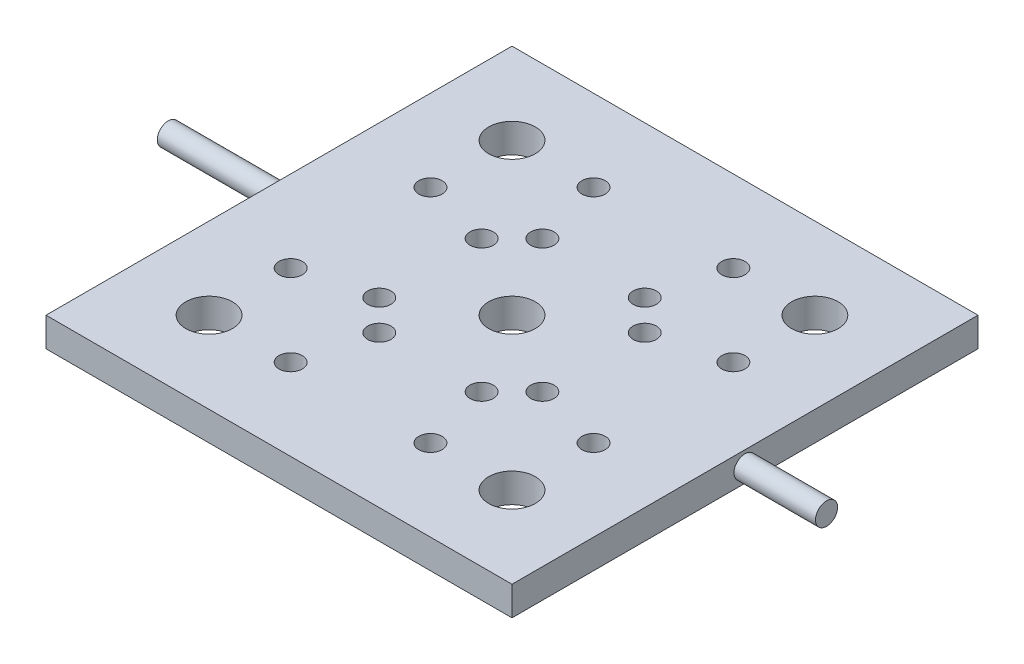
ISO-10303-21;
HEADER;
FILE_DESCRIPTION(('STEP AP214'),'2;1');
FILE_NAME('part.step','',(''),(''),'','','');
FILE_SCHEMA(('AUTOMOTIVE_DESIGN { 1 0 10303 214 1 1 1 1 }'));
ENDSEC;
DATA;
#1=APPLICATION_CONTEXT('core data for automotive mechanical design processes');
#2=APPLICATION_PROTOCOL_DEFINITION('international standard','automotive_design',2000,#1);
#3=PRODUCT_CONTEXT('',#1,'mechanical');
#4=PRODUCT('Part','Part','',(#3));
#5=PRODUCT_RELATED_PRODUCT_CATEGORY('part','',(#4));
#6=PRODUCT_DEFINITION_FORMATION('','',#4);
#7=PRODUCT_DEFINITION_CONTEXT('part definition',#1,'design');
#8=PRODUCT_DEFINITION('design','',#6,#7);
#9=PRODUCT_DEFINITION_SHAPE('','',#8);
#10=(LENGTH_UNIT() NAMED_UNIT(*) SI_UNIT(.MILLI.,.METRE.));
#11=(NAMED_UNIT(*) PLANE_ANGLE_UNIT() SI_UNIT($,.RADIAN.));
#12=(NAMED_UNIT(*) SI_UNIT($,.STERADIAN.) SOLID_ANGLE_UNIT());
#13=UNCERTAINTY_MEASURE_WITH_UNIT(LENGTH_MEASURE(1.E-05),#10,'distance_accuracy_value','');
#14=(GEOMETRIC_REPRESENTATION_CONTEXT(3) GLOBAL_UNCERTAINTY_ASSIGNED_CONTEXT((#13)) GLOBAL_UNIT_ASSIGNED_CONTEXT((#10,
#11,#12)) REPRESENTATION_CONTEXT('',''));
#15=CARTESIAN_POINT('',(0.,0.,0.));
#16=DIRECTION('',(0.,0.,1.));
#17=DIRECTION('',(1.,0.,0.));
#18=AXIS2_PLACEMENT_3D('',#15,#16,#17);
#19=CARTESIAN_POINT('',(25.4,1.5875,25.4));
#20=DIRECTION('',(-1.,0.,0.));
#21=DIRECTION('',(0.,0.,1.));
#22=AXIS2_PLACEMENT_3D('',#19,#20,#21);
#23=PLANE('',#22);
#24=CARTESIAN_POINT('',(25.4,0.,0.));
#25=DIRECTION('',(-1.,0.,0.));
#26=DIRECTION('',(0.,0.,1.));
#27=AXIS2_PLACEMENT_3D('',#24,#25,#26);
#28=CIRCLE('',#27,1.2065);
#29=CARTESIAN_POINT('',(25.4,0.,1.2065));
#30=VERTEX_POINT('',#29);
#31=EDGE_CURVE('E57',#30,#30,#28,.F.);
#32=ORIENTED_EDGE('',*,*,#31,.F.);
#33=EDGE_LOOP('',(#32));
#34=FACE_BOUND('',#33,.T.);
#35=DIRECTION('',(0.,0.,-1.));
#36=VECTOR('',#35,1.);
#37=CARTESIAN_POINT('',(25.4,-1.5875,25.4));
#38=LINE('',#37,#36);
#39=CARTESIAN_POINT('',(25.4,-1.5875,25.4));
#40=VERTEX_POINT('',#39);
#41=CARTESIAN_POINT('',(25.4,-1.5875,-25.4));
#42=VERTEX_POINT('',#41);
#43=EDGE_CURVE('E116',#40,#42,#38,.T.);
#44=ORIENTED_EDGE('',*,*,#43,.T.);
#45=DIRECTION('',(0.,-1.,0.));
#46=VECTOR('',#45,1.);
#47=CARTESIAN_POINT('',(25.4,1.5875,-25.4));
#48=LINE('',#47,#46);
#49=CARTESIAN_POINT('',(25.4,1.5875,-25.4));
#50=VERTEX_POINT('',#49);
#51=EDGE_CURVE('E107',#50,#42,#48,.T.);
#52=ORIENTED_EDGE('',*,*,#51,.F.);
#53=DIRECTION('',(0.,0.,-1.));
#54=VECTOR('',#53,1.);
#55=CARTESIAN_POINT('',(25.4,1.5875,25.4));
#56=LINE('',#55,#54);
#57=CARTESIAN_POINT('',(25.4,1.5875,25.4));
#58=VERTEX_POINT('',#57);
#59=EDGE_CURVE('E101',#58,#50,#56,.T.);
#60=ORIENTED_EDGE('',*,*,#59,.F.);
#61=DIRECTION('',(0.,-1.,0.));
#62=VECTOR('',#61,1.);
#63=CARTESIAN_POINT('',(25.4,1.5875,25.4));
#64=LINE('',#63,#62);
#65=EDGE_CURVE('E112',#58,#40,#64,.T.);
#66=ORIENTED_EDGE('',*,*,#65,.T.);
#67=EDGE_LOOP('',(#44,#52,#60,#66));
#68=FACE_BOUND('',#67,.T.);
#69=ADVANCED_FACE('F49',(#34,#68),#23,.F.);
#70=CARTESIAN_POINT('',(-25.4,1.5875,-25.4));
#71=DIRECTION('',(0.,0.,1.));
#72=DIRECTION('',(1.,0.,0.));
#73=AXIS2_PLACEMENT_3D('',#70,#71,#72);
#74=PLANE('',#73);
#75=DIRECTION('',(-1.,0.,0.));
#76=VECTOR('',#75,1.);
#77=CARTESIAN_POINT('',(-25.4,-1.5875,-25.4));
#78=LINE('',#77,#76);
#79=CARTESIAN_POINT('',(-25.4,-1.5875,-25.4));
#80=VERTEX_POINT('',#79);
#81=EDGE_CURVE('E106',#42,#80,#78,.T.);
#82=ORIENTED_EDGE('',*,*,#81,.T.);
#83=DIRECTION('',(0.,-1.,0.));
#84=VECTOR('',#83,1.);
#85=CARTESIAN_POINT('',(-25.4,1.5875,-25.4));
#86=LINE('',#85,#84);
#87=CARTESIAN_POINT('',(-25.4,1.5875,-25.4));
#88=VERTEX_POINT('',#87);
#89=EDGE_CURVE('E104',#88,#80,#86,.T.);
#90=ORIENTED_EDGE('',*,*,#89,.F.);
#91=DIRECTION('',(-1.,0.,0.));
#92=VECTOR('',#91,1.);
#93=CARTESIAN_POINT('',(-25.4,1.5875,-25.4));
#94=LINE('',#93,#92);
#95=EDGE_CURVE('E96',#50,#88,#94,.T.);
#96=ORIENTED_EDGE('',*,*,#95,.F.);
#97=ORIENTED_EDGE('',*,*,#51,.T.);
#98=EDGE_LOOP('',(#82,#90,#96,#97));
#99=FACE_BOUND('',#98,.T.);
#100=ADVANCED_FACE('F105',(#99),#74,.F.);
#101=CARTESIAN_POINT('',(-25.4,1.5875,25.4));
#102=DIRECTION('',(1.,0.,0.));
#103=DIRECTION('',(0.,0.,-1.));
#104=AXIS2_PLACEMENT_3D('',#101,#102,#103);
#105=PLANE('',#104);
#106=CARTESIAN_POINT('',(-25.4,0.,0.));
#107=DIRECTION('',(1.,0.,0.));
#108=DIRECTION('',(0.,0.,-1.));
#109=AXIS2_PLACEMENT_3D('',#106,#107,#108);
#110=CIRCLE('',#109,1.2065);
#111=CARTESIAN_POINT('',(-25.4,0.,-1.2065));
#112=VERTEX_POINT('',#111);
#113=EDGE_CURVE('E13',#112,#112,#110,.F.);
#114=ORIENTED_EDGE('',*,*,#113,.F.);
#115=EDGE_LOOP('',(#114));
#116=FACE_BOUND('',#115,.T.);
#117=DIRECTION('',(0.,0.,1.));
#118=VECTOR('',#117,1.);
#119=CARTESIAN_POINT('',(-25.4,-1.5875,25.4));
#120=LINE('',#119,#118);
#121=CARTESIAN_POINT('',(-25.4,-1.5875,25.4));
#122=VERTEX_POINT('',#121);
#123=EDGE_CURVE('E82',#80,#122,#120,.T.);
#124=ORIENTED_EDGE('',*,*,#123,.T.);
#125=DIRECTION('',(0.,-1.,0.));
#126=VECTOR('',#125,1.);
#127=CARTESIAN_POINT('',(-25.4,1.5875,25.4));
#128=LINE('',#127,#126);
#129=CARTESIAN_POINT('',(-25.4,1.5875,25.4));
#130=VERTEX_POINT('',#129);
#131=EDGE_CURVE('E108',#130,#122,#128,.T.);
#132=ORIENTED_EDGE('',*,*,#131,.F.);
#133=DIRECTION('',(0.,0.,1.));
#134=VECTOR('',#133,1.);
#135=CARTESIAN_POINT('',(-25.4,1.5875,25.4));
#136=LINE('',#135,#134);
#137=EDGE_CURVE('E99',#88,#130,#136,.T.);
#138=ORIENTED_EDGE('',*,*,#137,.F.);
#139=ORIENTED_EDGE('',*,*,#89,.T.);
#140=EDGE_LOOP('',(#124,#132,#138,#139));
#141=FACE_BOUND('',#140,.T.);
#142=ADVANCED_FACE('F110',(#116,#141),#105,.F.);
#143=CARTESIAN_POINT('',(-25.4,1.5875,25.4));
#144=DIRECTION('',(0.,0.,-1.));
#145=DIRECTION('',(-1.,0.,0.));
#146=AXIS2_PLACEMENT_3D('',#143,#144,#145);
#147=PLANE('',#146);
#148=DIRECTION('',(1.,0.,0.));
#149=VECTOR('',#148,1.);
#150=CARTESIAN_POINT('',(-25.4,-1.5875,25.4));
#151=LINE('',#150,#149);
#152=EDGE_CURVE('E88',#122,#40,#151,.T.);
#153=ORIENTED_EDGE('',*,*,#152,.T.);
#154=ORIENTED_EDGE('',*,*,#65,.F.);
#155=DIRECTION('',(1.,0.,0.));
#156=VECTOR('',#155,1.);
#157=CARTESIAN_POINT('',(-25.4,1.5875,25.4));
#158=LINE('',#157,#156);
#159=EDGE_CURVE('E65',#130,#58,#158,.T.);
#160=ORIENTED_EDGE('',*,*,#159,.F.);
#161=ORIENTED_EDGE('',*,*,#131,.T.);
#162=EDGE_LOOP('',(#153,#154,#160,#161));
#163=FACE_BOUND('',#162,.T.);
#164=ADVANCED_FACE('F145',(#163),#147,.F.);
#165=CARTESIAN_POINT('',(0.,1.5875,0.));
#166=DIRECTION('',(0.,-1.,0.));
#167=DIRECTION('',(0.,0.,-1.));
#168=AXIS2_PLACEMENT_3D('',#165,#166,#167);
#169=PLANE('',#168);
#170=CARTESIAN_POINT('',(-16.51,1.5875,7.62));
#171=DIRECTION('',(0.,1.,0.));
#172=DIRECTION('',(0.,0.,1.));
#173=AXIS2_PLACEMENT_3D('',#170,#171,#172);
#174=CIRCLE('',#173,1.27);
#175=CARTESIAN_POINT('',(-16.51,1.5875,8.89));
#176=VERTEX_POINT('',#175);
#177=EDGE_CURVE('E491',#176,#176,#174,.T.);
#178=ORIENTED_EDGE('',*,*,#177,.F.);
#179=EDGE_LOOP('',(#178));
#180=FACE_BOUND('',#179,.T.);
#181=CARTESIAN_POINT('',(16.51,1.5875,-7.62));
#182=DIRECTION('',(0.,1.,0.));
#183=DIRECTION('',(0.,0.,-1.));
#184=AXIS2_PLACEMENT_3D('',#181,#182,#183);
#185=CIRCLE('',#184,1.27);
#186=CARTESIAN_POINT('',(16.51,1.5875,-8.89));
#187=VERTEX_POINT('',#186);
#188=EDGE_CURVE('E497',#187,#187,#185,.T.);
#189=ORIENTED_EDGE('',*,*,#188,.F.);
#190=EDGE_LOOP('',(#189));
#191=FACE_BOUND('',#190,.T.);
#192=CARTESIAN_POINT('',(16.51,1.5875,7.62));
#193=DIRECTION('',(0.,1.,0.));
#194=DIRECTION('',(0.,0.,-1.));
#195=AXIS2_PLACEMENT_3D('',#192,#193,#194);
#196=CIRCLE('',#195,1.27);
#197=CARTESIAN_POINT('',(16.51,1.5875,6.35));
#198=VERTEX_POINT('',#197);
#199=EDGE_CURVE('E479',#198,#198,#196,.T.);
#200=ORIENTED_EDGE('',*,*,#199,.F.);
#201=EDGE_LOOP('',(#200));
#202=FACE_BOUND('',#201,.T.);
#203=CARTESIAN_POINT('',(-7.62000000000003,1.5875,16.51));
#204=DIRECTION('',(0.,1.,0.));
#205=DIRECTION('',(0.,0.,-1.));
#206=AXIS2_PLACEMENT_3D('',#203,#204,#205);
#207=CIRCLE('',#206,1.27);
#208=CARTESIAN_POINT('',(-7.62000000000003,1.5875,15.24));
#209=VERTEX_POINT('',#208);
#210=EDGE_CURVE('E486',#209,#209,#207,.T.);
#211=ORIENTED_EDGE('',*,*,#210,.F.);
#212=EDGE_LOOP('',(#211));
#213=FACE_BOUND('',#212,.T.);
#214=CARTESIAN_POINT('',(5.57822715367485,1.5875,-8.89000000000003));
#215=DIRECTION('',(0.,1.,0.));
#216=DIRECTION('',(0.,0.,1.));
#217=AXIS2_PLACEMENT_3D('',#214,#215,#216);
#218=CIRCLE('',#217,1.27000000000001);
#219=CARTESIAN_POINT('',(5.57822715367485,1.5875,-7.62000000000002));
#220=VERTEX_POINT('',#219);
#221=EDGE_CURVE('E521',#220,#220,#218,.T.);
#222=ORIENTED_EDGE('',*,*,#221,.F.);
#223=EDGE_LOOP('',(#222));
#224=FACE_BOUND('',#223,.T.);
#225=CARTESIAN_POINT('',(-5.57822715367481,1.5875,-8.88999999999992));
#226=DIRECTION('',(0.,1.,0.));
#227=DIRECTION('',(0.,0.,1.));
#228=AXIS2_PLACEMENT_3D('',#225,#226,#227);
#229=CIRCLE('',#228,1.27);
#230=CARTESIAN_POINT('',(-5.57822715367481,1.5875,-7.61999999999992));
#231=VERTEX_POINT('',#230);
#232=EDGE_CURVE('E515',#231,#231,#229,.T.);
#233=ORIENTED_EDGE('',*,*,#232,.F.);
#234=EDGE_LOOP('',(#233));
#235=FACE_BOUND('',#234,.T.);
#236=CARTESIAN_POINT('',(8.89000000000029,1.5875,5.57822715367478));
#237=DIRECTION('',(0.,1.,0.));
#238=DIRECTION('',(0.,0.,1.));
#239=AXIS2_PLACEMENT_3D('',#236,#237,#238);
#240=CIRCLE('',#239,1.27000000000001);
#241=CARTESIAN_POINT('',(8.89000000000029,1.5875,6.84822715367479));
#242=VERTEX_POINT('',#241);
#243=EDGE_CURVE('E509',#242,#242,#240,.T.);
#244=ORIENTED_EDGE('',*,*,#243,.F.);
#245=EDGE_LOOP('',(#244));
#246=FACE_BOUND('',#245,.T.);
#247=CARTESIAN_POINT('',(8.89000000000018,1.5875,-5.57822715367489));
#248=DIRECTION('',(0.,1.,0.));
#249=DIRECTION('',(0.,0.,1.));
#250=AXIS2_PLACEMENT_3D('',#247,#248,#249);
#251=CIRCLE('',#250,1.27);
#252=CARTESIAN_POINT('',(8.89000000000018,1.5875,-4.30822715367489));
#253=VERTEX_POINT('',#252);
#254=EDGE_CURVE('E502',#253,#253,#251,.T.);
#255=ORIENTED_EDGE('',*,*,#254,.F.);
#256=EDGE_LOOP('',(#255));
#257=FACE_BOUND('',#256,.T.);
#258=CARTESIAN_POINT('',(-16.51,1.5875,-16.51));
#259=DIRECTION('',(0.,1.,0.));
#260=DIRECTION('',(0.,0.,1.));
#261=AXIS2_PLACEMENT_3D('',#258,#259,#260);
#262=CIRCLE('',#261,2.54);
#263=CARTESIAN_POINT('',(-16.51,1.5875,-13.97));
#264=VERTEX_POINT('',#263);
#265=EDGE_CURVE('E450',#264,#264,#262,.T.);
#266=ORIENTED_EDGE('',*,*,#265,.F.);
#267=EDGE_LOOP('',(#266));
#268=FACE_BOUND('',#267,.T.);
#269=CARTESIAN_POINT('',(16.51,1.5875,-16.51));
#270=DIRECTION('',(0.,1.,0.));
#271=DIRECTION('',(0.,0.,1.));
#272=AXIS2_PLACEMENT_3D('',#269,#270,#271);
#273=CIRCLE('',#272,2.54);
#274=CARTESIAN_POINT('',(16.51,1.5875,-13.97));
#275=VERTEX_POINT('',#274);
#276=EDGE_CURVE('E444',#275,#275,#273,.T.);
#277=ORIENTED_EDGE('',*,*,#276,.F.);
#278=EDGE_LOOP('',(#277));
#279=FACE_BOUND('',#278,.T.);
#280=CARTESIAN_POINT('',(16.51,1.5875,16.51));
#281=DIRECTION('',(0.,1.,0.));
#282=DIRECTION('',(0.,0.,1.));
#283=AXIS2_PLACEMENT_3D('',#280,#281,#282);
#284=CIRCLE('',#283,2.54);
#285=CARTESIAN_POINT('',(16.51,1.5875,19.05));
#286=VERTEX_POINT('',#285);
#287=EDGE_CURVE('E438',#286,#286,#284,.T.);
#288=ORIENTED_EDGE('',*,*,#287,.F.);
#289=EDGE_LOOP('',(#288));
#290=FACE_BOUND('',#289,.T.);
#291=CARTESIAN_POINT('',(-16.51,1.5875,16.51));
#292=DIRECTION('',(0.,1.,0.));
#293=DIRECTION('',(0.,0.,1.));
#294=AXIS2_PLACEMENT_3D('',#291,#292,#293);
#295=CIRCLE('',#294,2.54);
#296=CARTESIAN_POINT('',(-16.51,1.5875,19.05));
#297=VERTEX_POINT('',#296);
#298=EDGE_CURVE('E431',#297,#297,#295,.T.);
#299=ORIENTED_EDGE('',*,*,#298,.F.);
#300=EDGE_LOOP('',(#299));
#301=FACE_BOUND('',#300,.T.);
#302=CARTESIAN_POINT('',(-16.51,1.5875,-7.62));
#303=DIRECTION('',(0.,1.,0.));
#304=DIRECTION('',(0.,0.,1.));
#305=AXIS2_PLACEMENT_3D('',#302,#303,#304);
#306=CIRCLE('',#305,1.27);
#307=CARTESIAN_POINT('',(-16.51,1.5875,-6.35));
#308=VERTEX_POINT('',#307);
#309=EDGE_CURVE('E474',#308,#308,#306,.T.);
#310=ORIENTED_EDGE('',*,*,#309,.F.);
#311=EDGE_LOOP('',(#310));
#312=FACE_BOUND('',#311,.T.);
#313=CARTESIAN_POINT('',(-7.62000000000001,1.5875,-16.51));
#314=DIRECTION('',(0.,1.,0.));
#315=DIRECTION('',(0.,0.,1.));
#316=AXIS2_PLACEMENT_3D('',#313,#314,#315);
#317=CIRCLE('',#316,1.27);
#318=CARTESIAN_POINT('',(-7.62000000000001,1.5875,-15.24));
#319=VERTEX_POINT('',#318);
#320=EDGE_CURVE('E468',#319,#319,#317,.T.);
#321=ORIENTED_EDGE('',*,*,#320,.F.);
#322=EDGE_LOOP('',(#321));
#323=FACE_BOUND('',#322,.T.);
#324=CARTESIAN_POINT('',(7.61999999999999,1.5875,-16.51));
#325=DIRECTION('',(0.,1.,0.));
#326=DIRECTION('',(0.,0.,1.));
#327=AXIS2_PLACEMENT_3D('',#324,#325,#326);
#328=CIRCLE('',#327,1.27);
#329=CARTESIAN_POINT('',(7.61999999999999,1.5875,-15.24));
#330=VERTEX_POINT('',#329);
#331=EDGE_CURVE('E462',#330,#330,#328,.T.);
#332=ORIENTED_EDGE('',*,*,#331,.F.);
#333=EDGE_LOOP('',(#332));
#334=FACE_BOUND('',#333,.T.);
#335=CARTESIAN_POINT('',(7.61999999999996,1.5875,16.51));
#336=DIRECTION('',(0.,1.,0.));
#337=DIRECTION('',(0.,0.,-1.));
#338=AXIS2_PLACEMENT_3D('',#335,#336,#337);
#339=CIRCLE('',#338,1.27);
#340=CARTESIAN_POINT('',(7.61999999999996,1.5875,15.24));
#341=VERTEX_POINT('',#340);
#342=EDGE_CURVE('E455',#341,#341,#339,.T.);
#343=ORIENTED_EDGE('',*,*,#342,.F.);
#344=EDGE_LOOP('',(#343));
#345=FACE_BOUND('',#344,.T.);
#346=CARTESIAN_POINT('',(-5.57822715367453,1.5875,8.89000000000022));
#347=DIRECTION('',(0.,1.,0.));
#348=DIRECTION('',(0.,0.,1.));
#349=AXIS2_PLACEMENT_3D('',#346,#347,#348);
#350=CIRCLE('',#349,1.27000000000001);
#351=CARTESIAN_POINT('',(-5.57822715367453,1.5875,10.1600000000002));
#352=VERTEX_POINT('',#351);
#353=EDGE_CURVE('E545',#352,#352,#350,.T.);
#354=ORIENTED_EDGE('',*,*,#353,.F.);
#355=EDGE_LOOP('',(#354));
#356=FACE_BOUND('',#355,.T.);
#357=CARTESIAN_POINT('',(5.57822715367514,1.5875,8.89000000000011));
#358=DIRECTION('',(0.,1.,0.));
#359=DIRECTION('',(0.,0.,1.));
#360=AXIS2_PLACEMENT_3D('',#357,#358,#359);
#361=CIRCLE('',#360,1.27);
#362=CARTESIAN_POINT('',(5.57822715367514,1.5875,10.1600000000001));
#363=VERTEX_POINT('',#362);
#364=EDGE_CURVE('E539',#363,#363,#361,.T.);
#365=ORIENTED_EDGE('',*,*,#364,.F.);
#366=EDGE_LOOP('',(#365));
#367=FACE_BOUND('',#366,.T.);
#368=CARTESIAN_POINT('',(-8.88999999999997,1.5875,-5.5782271536746));
#369=DIRECTION('',(0.,1.,0.));
#370=DIRECTION('',(0.,0.,1.));
#371=AXIS2_PLACEMENT_3D('',#368,#369,#370);
#372=CIRCLE('',#371,1.27000000000001);
#373=CARTESIAN_POINT('',(-8.88999999999997,1.5875,-4.30822715367459));
#374=VERTEX_POINT('',#373);
#375=EDGE_CURVE('E533',#374,#374,#372,.T.);
#376=ORIENTED_EDGE('',*,*,#375,.F.);
#377=EDGE_LOOP('',(#376));
#378=FACE_BOUND('',#377,.T.);
#379=CARTESIAN_POINT('',(-8.88999999999986,1.5875,5.57822715367507));
#380=DIRECTION('',(0.,1.,0.));
#381=DIRECTION('',(0.,0.,1.));
#382=AXIS2_PLACEMENT_3D('',#379,#380,#381);
#383=CIRCLE('',#382,1.27);
#384=CARTESIAN_POINT('',(-8.88999999999986,1.5875,6.84822715367507));
#385=VERTEX_POINT('',#384);
#386=EDGE_CURVE('E526',#385,#385,#383,.T.);
#387=ORIENTED_EDGE('',*,*,#386,.F.);
#388=EDGE_LOOP('',(#387));
#389=FACE_BOUND('',#388,.T.);
#390=CARTESIAN_POINT('',(0.,1.5875,0.));
#391=DIRECTION('',(0.,1.,0.));
#392=DIRECTION('',(0.,0.,1.));
#393=AXIS2_PLACEMENT_3D('',#390,#391,#392);
#394=CIRCLE('',#393,2.54);
#395=CARTESIAN_POINT('',(0.,1.5875,2.54));
#396=VERTEX_POINT('',#395);
#397=EDGE_CURVE('E425',#396,#396,#394,.T.);
#398=ORIENTED_EDGE('',*,*,#397,.F.);
#399=EDGE_LOOP('',(#398));
#400=FACE_BOUND('',#399,.T.);
#401=ORIENTED_EDGE('',*,*,#59,.T.);
#402=ORIENTED_EDGE('',*,*,#95,.T.);
#403=ORIENTED_EDGE('',*,*,#137,.T.);
#404=ORIENTED_EDGE('',*,*,#159,.T.);
#405=EDGE_LOOP('',(#401,#402,#403,#404));
#406=FACE_BOUND('',#405,.T.);
#407=ADVANCED_FACE('F97',(#180,#191,#202,#213,#224,#235,#246,#257,#268,#279,#290,#301,#312,#323,
#334,#345,#356,#367,#378,#389,#400,#406),#169,.F.);
#408=CARTESIAN_POINT('',(0.,-1.5875,0.));
#409=DIRECTION('',(0.,-1.,0.));
#410=DIRECTION('',(0.,0.,-1.));
#411=AXIS2_PLACEMENT_3D('',#408,#409,#410);
#412=PLANE('',#411);
#413=CARTESIAN_POINT('',(-16.51,-1.5875,7.62));
#414=DIRECTION('',(0.,1.,0.));
#415=DIRECTION('',(0.,0.,1.));
#416=AXIS2_PLACEMENT_3D('',#413,#414,#415);
#417=CIRCLE('',#416,1.27);
#418=CARTESIAN_POINT('',(-16.51,-1.5875,8.89));
#419=VERTEX_POINT('',#418);
#420=EDGE_CURVE('E494',#419,#419,#417,.T.);
#421=ORIENTED_EDGE('',*,*,#420,.T.);
#422=EDGE_LOOP('',(#421));
#423=FACE_BOUND('',#422,.T.);
#424=CARTESIAN_POINT('',(16.51,-1.5875,-7.62));
#425=DIRECTION('',(0.,1.,0.));
#426=DIRECTION('',(0.,0.,-1.));
#427=AXIS2_PLACEMENT_3D('',#424,#425,#426);
#428=CIRCLE('',#427,1.27);
#429=CARTESIAN_POINT('',(16.51,-1.5875,-8.89));
#430=VERTEX_POINT('',#429);
#431=EDGE_CURVE('E483',#430,#430,#428,.T.);
#432=ORIENTED_EDGE('',*,*,#431,.T.);
#433=EDGE_LOOP('',(#432));
#434=FACE_BOUND('',#433,.T.);
#435=CARTESIAN_POINT('',(16.51,-1.5875,7.62));
#436=DIRECTION('',(0.,1.,0.));
#437=DIRECTION('',(0.,0.,-1.));
#438=AXIS2_PLACEMENT_3D('',#435,#436,#437);
#439=CIRCLE('',#438,1.27);
#440=CARTESIAN_POINT('',(16.51,-1.5875,6.35));
#441=VERTEX_POINT('',#440);
#442=EDGE_CURVE('E482',#441,#441,#439,.T.);
#443=ORIENTED_EDGE('',*,*,#442,.T.);
#444=EDGE_LOOP('',(#443));
#445=FACE_BOUND('',#444,.T.);
#446=CARTESIAN_POINT('',(-7.62000000000003,-1.5875,16.51));
#447=DIRECTION('',(0.,1.,0.));
#448=DIRECTION('',(0.,0.,-1.));
#449=AXIS2_PLACEMENT_3D('',#446,#447,#448);
#450=CIRCLE('',#449,1.27);
#451=CARTESIAN_POINT('',(-7.62000000000003,-1.5875,15.24));
#452=VERTEX_POINT('',#451);
#453=EDGE_CURVE('E459',#452,#452,#450,.T.);
#454=ORIENTED_EDGE('',*,*,#453,.T.);
#455=EDGE_LOOP('',(#454));
#456=FACE_BOUND('',#455,.T.);
#457=CARTESIAN_POINT('',(5.57822715367485,-1.5875,-8.89000000000003));
#458=DIRECTION('',(0.,1.,0.));
#459=DIRECTION('',(0.,0.,1.));
#460=AXIS2_PLACEMENT_3D('',#457,#458,#459);
#461=CIRCLE('',#460,1.27000000000001);
#462=CARTESIAN_POINT('',(5.57822715367485,-1.5875,-7.62000000000002));
#463=VERTEX_POINT('',#462);
#464=EDGE_CURVE('E495',#463,#463,#461,.T.);
#465=ORIENTED_EDGE('',*,*,#464,.T.);
#466=EDGE_LOOP('',(#465));
#467=FACE_BOUND('',#466,.T.);
#468=CARTESIAN_POINT('',(-5.57822715367481,-1.5875,-8.88999999999992));
#469=DIRECTION('',(0.,1.,0.));
#470=DIRECTION('',(0.,0.,1.));
#471=AXIS2_PLACEMENT_3D('',#468,#469,#470);
#472=CIRCLE('',#471,1.27);
#473=CARTESIAN_POINT('',(-5.57822715367481,-1.5875,-7.61999999999992));
#474=VERTEX_POINT('',#473);
#475=EDGE_CURVE('E518',#474,#474,#472,.T.);
#476=ORIENTED_EDGE('',*,*,#475,.T.);
#477=EDGE_LOOP('',(#476));
#478=FACE_BOUND('',#477,.T.);
#479=CARTESIAN_POINT('',(8.89000000000029,-1.5875,5.57822715367478));
#480=DIRECTION('',(0.,1.,0.));
#481=DIRECTION('',(0.,0.,1.));
#482=AXIS2_PLACEMENT_3D('',#479,#480,#481);
#483=CIRCLE('',#482,1.27000000000001);
#484=CARTESIAN_POINT('',(8.89000000000029,-1.5875,6.84822715367479));
#485=VERTEX_POINT('',#484);
#486=EDGE_CURVE('E512',#485,#485,#483,.T.);
#487=ORIENTED_EDGE('',*,*,#486,.T.);
#488=EDGE_LOOP('',(#487));
#489=FACE_BOUND('',#488,.T.);
#490=CARTESIAN_POINT('',(8.89000000000018,-1.5875,-5.57822715367489));
#491=DIRECTION('',(0.,1.,0.));
#492=DIRECTION('',(0.,0.,1.));
#493=AXIS2_PLACEMENT_3D('',#490,#491,#492);
#494=CIRCLE('',#493,1.27);
#495=CARTESIAN_POINT('',(8.89000000000018,-1.5875,-4.30822715367489));
#496=VERTEX_POINT('',#495);
#497=EDGE_CURVE('E505',#496,#496,#494,.T.);
#498=ORIENTED_EDGE('',*,*,#497,.T.);
#499=EDGE_LOOP('',(#498));
#500=FACE_BOUND('',#499,.T.);
#501=CARTESIAN_POINT('',(-16.51,-1.5875,-16.51));
#502=DIRECTION('',(0.,1.,0.));
#503=DIRECTION('',(0.,0.,1.));
#504=AXIS2_PLACEMENT_3D('',#501,#502,#503);
#505=CIRCLE('',#504,2.54);
#506=CARTESIAN_POINT('',(-16.51,-1.5875,-13.97));
#507=VERTEX_POINT('',#506);
#508=EDGE_CURVE('E429',#507,#507,#505,.T.);
#509=ORIENTED_EDGE('',*,*,#508,.T.);
#510=EDGE_LOOP('',(#509));
#511=FACE_BOUND('',#510,.T.);
#512=CARTESIAN_POINT('',(16.51,-1.5875,-16.51));
#513=DIRECTION('',(0.,1.,0.));
#514=DIRECTION('',(0.,0.,1.));
#515=AXIS2_PLACEMENT_3D('',#512,#513,#514);
#516=CIRCLE('',#515,2.54);
#517=CARTESIAN_POINT('',(16.51,-1.5875,-13.97));
#518=VERTEX_POINT('',#517);
#519=EDGE_CURVE('E447',#518,#518,#516,.T.);
#520=ORIENTED_EDGE('',*,*,#519,.T.);
#521=EDGE_LOOP('',(#520));
#522=FACE_BOUND('',#521,.T.);
#523=CARTESIAN_POINT('',(16.51,-1.5875,16.51));
#524=DIRECTION('',(0.,1.,0.));
#525=DIRECTION('',(0.,0.,1.));
#526=AXIS2_PLACEMENT_3D('',#523,#524,#525);
#527=CIRCLE('',#526,2.54);
#528=CARTESIAN_POINT('',(16.51,-1.5875,19.05));
#529=VERTEX_POINT('',#528);
#530=EDGE_CURVE('E441',#529,#529,#527,.T.);
#531=ORIENTED_EDGE('',*,*,#530,.T.);
#532=EDGE_LOOP('',(#531));
#533=FACE_BOUND('',#532,.T.);
#534=CARTESIAN_POINT('',(-16.51,-1.5875,16.51));
#535=DIRECTION('',(0.,1.,0.));
#536=DIRECTION('',(0.,0.,1.));
#537=AXIS2_PLACEMENT_3D('',#534,#535,#536);
#538=CIRCLE('',#537,2.54);
#539=CARTESIAN_POINT('',(-16.51,-1.5875,19.05));
#540=VERTEX_POINT('',#539);
#541=EDGE_CURVE('E434',#540,#540,#538,.T.);
#542=ORIENTED_EDGE('',*,*,#541,.T.);
#543=EDGE_LOOP('',(#542));
#544=FACE_BOUND('',#543,.T.);
#545=CARTESIAN_POINT('',(-16.51,-1.5875,-7.62));
#546=DIRECTION('',(0.,1.,0.));
#547=DIRECTION('',(0.,0.,1.));
#548=AXIS2_PLACEMENT_3D('',#545,#546,#547);
#549=CIRCLE('',#548,1.27);
#550=CARTESIAN_POINT('',(-16.51,-1.5875,-6.35));
#551=VERTEX_POINT('',#550);
#552=EDGE_CURVE('E435',#551,#551,#549,.T.);
#553=ORIENTED_EDGE('',*,*,#552,.T.);
#554=EDGE_LOOP('',(#553));
#555=FACE_BOUND('',#554,.T.);
#556=CARTESIAN_POINT('',(-7.62000000000001,-1.5875,-16.51));
#557=DIRECTION('',(0.,1.,0.));
#558=DIRECTION('',(0.,0.,1.));
#559=AXIS2_PLACEMENT_3D('',#556,#557,#558);
#560=CIRCLE('',#559,1.27);
#561=CARTESIAN_POINT('',(-7.62000000000001,-1.5875,-15.24));
#562=VERTEX_POINT('',#561);
#563=EDGE_CURVE('E471',#562,#562,#560,.T.);
#564=ORIENTED_EDGE('',*,*,#563,.T.);
#565=EDGE_LOOP('',(#564));
#566=FACE_BOUND('',#565,.T.);
#567=CARTESIAN_POINT('',(7.61999999999999,-1.5875,-16.51));
#568=DIRECTION('',(0.,1.,0.));
#569=DIRECTION('',(0.,0.,1.));
#570=AXIS2_PLACEMENT_3D('',#567,#568,#569);
#571=CIRCLE('',#570,1.27);
#572=CARTESIAN_POINT('',(7.61999999999999,-1.5875,-15.24));
#573=VERTEX_POINT('',#572);
#574=EDGE_CURVE('E465',#573,#573,#571,.T.);
#575=ORIENTED_EDGE('',*,*,#574,.T.);
#576=EDGE_LOOP('',(#575));
#577=FACE_BOUND('',#576,.T.);
#578=CARTESIAN_POINT('',(7.61999999999996,-1.5875,16.51));
#579=DIRECTION('',(0.,1.,0.));
#580=DIRECTION('',(0.,0.,-1.));
#581=AXIS2_PLACEMENT_3D('',#578,#579,#580);
#582=CIRCLE('',#581,1.27);
#583=CARTESIAN_POINT('',(7.61999999999996,-1.5875,15.24));
#584=VERTEX_POINT('',#583);
#585=EDGE_CURVE('E458',#584,#584,#582,.T.);
#586=ORIENTED_EDGE('',*,*,#585,.T.);
#587=EDGE_LOOP('',(#586));
#588=FACE_BOUND('',#587,.T.);
#589=CARTESIAN_POINT('',(-5.57822715367453,-1.5875,8.89000000000022));
#590=DIRECTION('',(0.,1.,0.));
#591=DIRECTION('',(0.,0.,1.));
#592=AXIS2_PLACEMENT_3D('',#589,#590,#591);
#593=CIRCLE('',#592,1.27000000000001);
#594=CARTESIAN_POINT('',(-5.57822715367453,-1.5875,10.1600000000002));
#595=VERTEX_POINT('',#594);
#596=EDGE_CURVE('E506',#595,#595,#593,.T.);
#597=ORIENTED_EDGE('',*,*,#596,.T.);
#598=EDGE_LOOP('',(#597));
#599=FACE_BOUND('',#598,.T.);
#600=CARTESIAN_POINT('',(5.57822715367514,-1.5875,8.89000000000011));
#601=DIRECTION('',(0.,1.,0.));
#602=DIRECTION('',(0.,0.,1.));
#603=AXIS2_PLACEMENT_3D('',#600,#601,#602);
#604=CIRCLE('',#603,1.27);
#605=CARTESIAN_POINT('',(5.57822715367514,-1.5875,10.1600000000001));
#606=VERTEX_POINT('',#605);
#607=EDGE_CURVE('E542',#606,#606,#604,.T.);
#608=ORIENTED_EDGE('',*,*,#607,.T.);
#609=EDGE_LOOP('',(#608));
#610=FACE_BOUND('',#609,.T.);
#611=CARTESIAN_POINT('',(-8.88999999999997,-1.5875,-5.5782271536746));
#612=DIRECTION('',(0.,1.,0.));
#613=DIRECTION('',(0.,0.,1.));
#614=AXIS2_PLACEMENT_3D('',#611,#612,#613);
#615=CIRCLE('',#614,1.27000000000001);
#616=CARTESIAN_POINT('',(-8.88999999999997,-1.5875,-4.30822715367459));
#617=VERTEX_POINT('',#616);
#618=EDGE_CURVE('E536',#617,#617,#615,.T.);
#619=ORIENTED_EDGE('',*,*,#618,.T.);
#620=EDGE_LOOP('',(#619));
#621=FACE_BOUND('',#620,.T.);
#622=CARTESIAN_POINT('',(-8.88999999999986,-1.5875,5.57822715367507));
#623=DIRECTION('',(0.,1.,0.));
#624=DIRECTION('',(0.,0.,1.));
#625=AXIS2_PLACEMENT_3D('',#622,#623,#624);
#626=CIRCLE('',#625,1.27);
#627=CARTESIAN_POINT('',(-8.88999999999986,-1.5875,6.84822715367507));
#628=VERTEX_POINT('',#627);
#629=EDGE_CURVE('E529',#628,#628,#626,.T.);
#630=ORIENTED_EDGE('',*,*,#629,.T.);
#631=EDGE_LOOP('',(#630));
#632=FACE_BOUND('',#631,.T.);
#633=CARTESIAN_POINT('',(0.,-1.5875,0.));
#634=DIRECTION('',(0.,1.,0.));
#635=DIRECTION('',(0.,0.,1.));
#636=AXIS2_PLACEMENT_3D('',#633,#634,#635);
#637=CIRCLE('',#636,2.54);
#638=CARTESIAN_POINT('',(0.,-1.5875,2.54));
#639=VERTEX_POINT('',#638);
#640=EDGE_CURVE('E422',#639,#639,#637,.T.);
#641=ORIENTED_EDGE('',*,*,#640,.T.);
#642=EDGE_LOOP('',(#641));
#643=FACE_BOUND('',#642,.T.);
#644=ORIENTED_EDGE('',*,*,#43,.F.);
#645=ORIENTED_EDGE('',*,*,#152,.F.);
#646=ORIENTED_EDGE('',*,*,#123,.F.);
#647=ORIENTED_EDGE('',*,*,#81,.F.);
#648=EDGE_LOOP('',(#644,#645,#646,#647));
#649=FACE_BOUND('',#648,.T.);
#650=ADVANCED_FACE('F134',(#423,#434,#445,#456,#467,#478,#489,#500,#511,#522,#533,#544,#555,
#566,#577,#588,#599,#610,#621,#632,#643,#649),#412,.T.);
#651=CARTESIAN_POINT('',(34.29,0.,0.));
#652=DIRECTION('',(-1.,0.,0.));
#653=DIRECTION('',(0.,0.,1.));
#654=AXIS2_PLACEMENT_3D('',#651,#652,#653);
#655=CYLINDRICAL_SURFACE('',#654,1.2065);
#656=CARTESIAN_POINT('',(34.29,0.,0.));
#657=DIRECTION('',(1.,0.,0.));
#658=DIRECTION('',(0.,0.,-1.));
#659=AXIS2_PLACEMENT_3D('',#656,#657,#658);
#660=CIRCLE('',#659,1.2065);
#661=CARTESIAN_POINT('',(34.29,0.,-1.2065));
#662=VERTEX_POINT('',#661);
#663=EDGE_CURVE('E119',#662,#662,#660,.T.);
#664=ORIENTED_EDGE('',*,*,#663,.F.);
#665=EDGE_LOOP('',(#664));
#666=FACE_BOUND('',#665,.T.);
#667=ORIENTED_EDGE('',*,*,#31,.T.);
#668=EDGE_LOOP('',(#667));
#669=FACE_BOUND('',#668,.T.);
#670=ADVANCED_FACE('F128',(#666,#669),#655,.T.);
#671=CARTESIAN_POINT('',(34.29,0.,0.));
#672=DIRECTION('',(1.,0.,0.));
#673=DIRECTION('',(0.,0.,-1.));
#674=AXIS2_PLACEMENT_3D('',#671,#672,#673);
#675=PLANE('',#674);
#676=ORIENTED_EDGE('',*,*,#663,.T.);
#677=EDGE_LOOP('',(#676));
#678=FACE_BOUND('',#677,.T.);
#679=ADVANCED_FACE('F142',(#678),#675,.T.);
#680=CARTESIAN_POINT('',(0.,-1.5875,0.));
#681=DIRECTION('',(0.,1.,0.));
#682=DIRECTION('',(0.,0.,1.));
#683=AXIS2_PLACEMENT_3D('',#680,#681,#682);
#684=CYLINDRICAL_SURFACE('',#683,2.54);
#685=ORIENTED_EDGE('',*,*,#640,.F.);
#686=EDGE_LOOP('',(#685));
#687=FACE_BOUND('',#686,.T.);
#688=ORIENTED_EDGE('',*,*,#397,.T.);
#689=EDGE_LOOP('',(#688));
#690=FACE_BOUND('',#689,.T.);
#691=ADVANCED_FACE('F189',(#687,#690),#684,.F.);
#692=CARTESIAN_POINT('',(-8.88999999999986,-1.5875,5.57822715367507));
#693=DIRECTION('',(0.,1.,0.));
#694=DIRECTION('',(0.,0.,1.));
#695=AXIS2_PLACEMENT_3D('',#692,#693,#694);
#696=CYLINDRICAL_SURFACE('',#695,1.27);
#697=ORIENTED_EDGE('',*,*,#629,.F.);
#698=EDGE_LOOP('',(#697));
#699=FACE_BOUND('',#698,.T.);
#700=ORIENTED_EDGE('',*,*,#386,.T.);
#701=EDGE_LOOP('',(#700));
#702=FACE_BOUND('',#701,.T.);
#703=ADVANCED_FACE('F194',(#699,#702),#696,.F.);
#704=CARTESIAN_POINT('',(-8.88999999999997,-1.5875,-5.5782271536746));
#705=DIRECTION('',(0.,1.,0.));
#706=DIRECTION('',(0.,0.,1.));
#707=AXIS2_PLACEMENT_3D('',#704,#705,#706);
#708=CYLINDRICAL_SURFACE('',#707,1.27000000000001);
#709=ORIENTED_EDGE('',*,*,#618,.F.);
#710=EDGE_LOOP('',(#709));
#711=FACE_BOUND('',#710,.T.);
#712=ORIENTED_EDGE('',*,*,#375,.T.);
#713=EDGE_LOOP('',(#712));
#714=FACE_BOUND('',#713,.T.);
#715=ADVANCED_FACE('F204',(#711,#714),#708,.F.);
#716=CARTESIAN_POINT('',(5.57822715367514,-1.5875,8.89000000000011));
#717=DIRECTION('',(0.,1.,0.));
#718=DIRECTION('',(0.,0.,1.));
#719=AXIS2_PLACEMENT_3D('',#716,#717,#718);
#720=CYLINDRICAL_SURFACE('',#719,1.27);
#721=ORIENTED_EDGE('',*,*,#607,.F.);
#722=EDGE_LOOP('',(#721));
#723=FACE_BOUND('',#722,.T.);
#724=ORIENTED_EDGE('',*,*,#364,.T.);
#725=EDGE_LOOP('',(#724));
#726=FACE_BOUND('',#725,.T.);
#727=ADVANCED_FACE('F214',(#723,#726),#720,.F.);
#728=CARTESIAN_POINT('',(-5.57822715367453,-1.5875,8.89000000000022));
#729=DIRECTION('',(0.,1.,0.));
#730=DIRECTION('',(0.,0.,1.));
#731=AXIS2_PLACEMENT_3D('',#728,#729,#730);
#732=CYLINDRICAL_SURFACE('',#731,1.27000000000001);
#733=ORIENTED_EDGE('',*,*,#596,.F.);
#734=EDGE_LOOP('',(#733));
#735=FACE_BOUND('',#734,.T.);
#736=ORIENTED_EDGE('',*,*,#353,.T.);
#737=EDGE_LOOP('',(#736));
#738=FACE_BOUND('',#737,.T.);
#739=ADVANCED_FACE('F224',(#735,#738),#732,.F.);
#740=CARTESIAN_POINT('',(7.61999999999996,-1.5875,16.51));
#741=DIRECTION('',(0.,1.,0.));
#742=DIRECTION('',(0.,0.,1.));
#743=AXIS2_PLACEMENT_3D('',#740,#741,#742);
#744=CYLINDRICAL_SURFACE('',#743,1.27);
#745=ORIENTED_EDGE('',*,*,#585,.F.);
#746=EDGE_LOOP('',(#745));
#747=FACE_BOUND('',#746,.T.);
#748=ORIENTED_EDGE('',*,*,#342,.T.);
#749=EDGE_LOOP('',(#748));
#750=FACE_BOUND('',#749,.T.);
#751=ADVANCED_FACE('F234',(#747,#750),#744,.F.);
#752=CARTESIAN_POINT('',(7.61999999999999,-1.5875,-16.51));
#753=DIRECTION('',(0.,1.,0.));
#754=DIRECTION('',(0.,0.,1.));
#755=AXIS2_PLACEMENT_3D('',#752,#753,#754);
#756=CYLINDRICAL_SURFACE('',#755,1.27);
#757=ORIENTED_EDGE('',*,*,#574,.F.);
#758=EDGE_LOOP('',(#757));
#759=FACE_BOUND('',#758,.T.);
#760=ORIENTED_EDGE('',*,*,#331,.T.);
#761=EDGE_LOOP('',(#760));
#762=FACE_BOUND('',#761,.T.);
#763=ADVANCED_FACE('F244',(#759,#762),#756,.F.);
#764=CARTESIAN_POINT('',(-7.62000000000001,-1.5875,-16.51));
#765=DIRECTION('',(0.,1.,0.));
#766=DIRECTION('',(0.,0.,1.));
#767=AXIS2_PLACEMENT_3D('',#764,#765,#766);
#768=CYLINDRICAL_SURFACE('',#767,1.27);
#769=ORIENTED_EDGE('',*,*,#563,.F.);
#770=EDGE_LOOP('',(#769));
#771=FACE_BOUND('',#770,.T.);
#772=ORIENTED_EDGE('',*,*,#320,.T.);
#773=EDGE_LOOP('',(#772));
#774=FACE_BOUND('',#773,.T.);
#775=ADVANCED_FACE('F254',(#771,#774),#768,.F.);
#776=CARTESIAN_POINT('',(-16.51,-1.5875,-7.62));
#777=DIRECTION('',(0.,1.,0.));
#778=DIRECTION('',(0.,0.,1.));
#779=AXIS2_PLACEMENT_3D('',#776,#777,#778);
#780=CYLINDRICAL_SURFACE('',#779,1.27);
#781=ORIENTED_EDGE('',*,*,#552,.F.);
#782=EDGE_LOOP('',(#781));
#783=FACE_BOUND('',#782,.T.);
#784=ORIENTED_EDGE('',*,*,#309,.T.);
#785=EDGE_LOOP('',(#784));
#786=FACE_BOUND('',#785,.T.);
#787=ADVANCED_FACE('F264',(#783,#786),#780,.F.);
#788=CARTESIAN_POINT('',(-16.51,-1.5875,16.51));
#789=DIRECTION('',(0.,1.,0.));
#790=DIRECTION('',(0.,0.,1.));
#791=AXIS2_PLACEMENT_3D('',#788,#789,#790);
#792=CYLINDRICAL_SURFACE('',#791,2.54);
#793=ORIENTED_EDGE('',*,*,#541,.F.);
#794=EDGE_LOOP('',(#793));
#795=FACE_BOUND('',#794,.T.);
#796=ORIENTED_EDGE('',*,*,#298,.T.);
#797=EDGE_LOOP('',(#796));
#798=FACE_BOUND('',#797,.T.);
#799=ADVANCED_FACE('F274',(#795,#798),#792,.F.);
#800=CARTESIAN_POINT('',(16.51,-1.5875,16.51));
#801=DIRECTION('',(0.,1.,0.));
#802=DIRECTION('',(0.,0.,1.));
#803=AXIS2_PLACEMENT_3D('',#800,#801,#802);
#804=CYLINDRICAL_SURFACE('',#803,2.54);
#805=ORIENTED_EDGE('',*,*,#530,.F.);
#806=EDGE_LOOP('',(#805));
#807=FACE_BOUND('',#806,.T.);
#808=ORIENTED_EDGE('',*,*,#287,.T.);
#809=EDGE_LOOP('',(#808));
#810=FACE_BOUND('',#809,.T.);
#811=ADVANCED_FACE('F284',(#807,#810),#804,.F.);
#812=CARTESIAN_POINT('',(16.51,-1.5875,-16.51));
#813=DIRECTION('',(0.,1.,0.));
#814=DIRECTION('',(0.,0.,1.));
#815=AXIS2_PLACEMENT_3D('',#812,#813,#814);
#816=CYLINDRICAL_SURFACE('',#815,2.54);
#817=ORIENTED_EDGE('',*,*,#519,.F.);
#818=EDGE_LOOP('',(#817));
#819=FACE_BOUND('',#818,.T.);
#820=ORIENTED_EDGE('',*,*,#276,.T.);
#821=EDGE_LOOP('',(#820));
#822=FACE_BOUND('',#821,.T.);
#823=ADVANCED_FACE('F294',(#819,#822),#816,.F.);
#824=CARTESIAN_POINT('',(-16.51,-1.5875,-16.51));
#825=DIRECTION('',(0.,1.,0.));
#826=DIRECTION('',(0.,0.,1.));
#827=AXIS2_PLACEMENT_3D('',#824,#825,#826);
#828=CYLINDRICAL_SURFACE('',#827,2.54);
#829=ORIENTED_EDGE('',*,*,#508,.F.);
#830=EDGE_LOOP('',(#829));
#831=FACE_BOUND('',#830,.T.);
#832=ORIENTED_EDGE('',*,*,#265,.T.);
#833=EDGE_LOOP('',(#832));
#834=FACE_BOUND('',#833,.T.);
#835=ADVANCED_FACE('F304',(#831,#834),#828,.F.);
#836=CARTESIAN_POINT('',(8.89000000000018,-1.5875,-5.57822715367489));
#837=DIRECTION('',(0.,1.,0.));
#838=DIRECTION('',(0.,0.,1.));
#839=AXIS2_PLACEMENT_3D('',#836,#837,#838);
#840=CYLINDRICAL_SURFACE('',#839,1.27);
#841=ORIENTED_EDGE('',*,*,#497,.F.);
#842=EDGE_LOOP('',(#841));
#843=FACE_BOUND('',#842,.T.);
#844=ORIENTED_EDGE('',*,*,#254,.T.);
#845=EDGE_LOOP('',(#844));
#846=FACE_BOUND('',#845,.T.);
#847=ADVANCED_FACE('F314',(#843,#846),#840,.F.);
#848=CARTESIAN_POINT('',(8.89000000000029,-1.5875,5.57822715367478));
#849=DIRECTION('',(0.,1.,0.));
#850=DIRECTION('',(0.,0.,1.));
#851=AXIS2_PLACEMENT_3D('',#848,#849,#850);
#852=CYLINDRICAL_SURFACE('',#851,1.27000000000001);
#853=ORIENTED_EDGE('',*,*,#486,.F.);
#854=EDGE_LOOP('',(#853));
#855=FACE_BOUND('',#854,.T.);
#856=ORIENTED_EDGE('',*,*,#243,.T.);
#857=EDGE_LOOP('',(#856));
#858=FACE_BOUND('',#857,.T.);
#859=ADVANCED_FACE('F324',(#855,#858),#852,.F.);
#860=CARTESIAN_POINT('',(-5.57822715367481,-1.5875,-8.88999999999992));
#861=DIRECTION('',(0.,1.,0.));
#862=DIRECTION('',(0.,0.,1.));
#863=AXIS2_PLACEMENT_3D('',#860,#861,#862);
#864=CYLINDRICAL_SURFACE('',#863,1.27);
#865=ORIENTED_EDGE('',*,*,#475,.F.);
#866=EDGE_LOOP('',(#865));
#867=FACE_BOUND('',#866,.T.);
#868=ORIENTED_EDGE('',*,*,#232,.T.);
#869=EDGE_LOOP('',(#868));
#870=FACE_BOUND('',#869,.T.);
#871=ADVANCED_FACE('F334',(#867,#870),#864,.F.);
#872=CARTESIAN_POINT('',(5.57822715367485,-1.5875,-8.89000000000003));
#873=DIRECTION('',(0.,1.,0.));
#874=DIRECTION('',(0.,0.,1.));
#875=AXIS2_PLACEMENT_3D('',#872,#873,#874);
#876=CYLINDRICAL_SURFACE('',#875,1.27000000000001);
#877=ORIENTED_EDGE('',*,*,#464,.F.);
#878=EDGE_LOOP('',(#877));
#879=FACE_BOUND('',#878,.T.);
#880=ORIENTED_EDGE('',*,*,#221,.T.);
#881=EDGE_LOOP('',(#880));
#882=FACE_BOUND('',#881,.T.);
#883=ADVANCED_FACE('F344',(#879,#882),#876,.F.);
#884=CARTESIAN_POINT('',(-7.62000000000003,-1.5875,16.51));
#885=DIRECTION('',(0.,1.,0.));
#886=DIRECTION('',(0.,0.,1.));
#887=AXIS2_PLACEMENT_3D('',#884,#885,#886);
#888=CYLINDRICAL_SURFACE('',#887,1.27);
#889=ORIENTED_EDGE('',*,*,#453,.F.);
#890=EDGE_LOOP('',(#889));
#891=FACE_BOUND('',#890,.T.);
#892=ORIENTED_EDGE('',*,*,#210,.T.);
#893=EDGE_LOOP('',(#892));
#894=FACE_BOUND('',#893,.T.);
#895=ADVANCED_FACE('F354',(#891,#894),#888,.F.);
#896=CARTESIAN_POINT('',(16.51,-1.5875,7.62));
#897=DIRECTION('',(0.,1.,0.));
#898=DIRECTION('',(0.,0.,1.));
#899=AXIS2_PLACEMENT_3D('',#896,#897,#898);
#900=CYLINDRICAL_SURFACE('',#899,1.27);
#901=ORIENTED_EDGE('',*,*,#442,.F.);
#902=EDGE_LOOP('',(#901));
#903=FACE_BOUND('',#902,.T.);
#904=ORIENTED_EDGE('',*,*,#199,.T.);
#905=EDGE_LOOP('',(#904));
#906=FACE_BOUND('',#905,.T.);
#907=ADVANCED_FACE('F364',(#903,#906),#900,.F.);
#908=CARTESIAN_POINT('',(16.51,-1.5875,-7.62));
#909=DIRECTION('',(0.,1.,0.));
#910=DIRECTION('',(0.,0.,1.));
#911=AXIS2_PLACEMENT_3D('',#908,#909,#910);
#912=CYLINDRICAL_SURFACE('',#911,1.27);
#913=ORIENTED_EDGE('',*,*,#431,.F.);
#914=EDGE_LOOP('',(#913));
#915=FACE_BOUND('',#914,.T.);
#916=ORIENTED_EDGE('',*,*,#188,.T.);
#917=EDGE_LOOP('',(#916));
#918=FACE_BOUND('',#917,.T.);
#919=ADVANCED_FACE('F374',(#915,#918),#912,.F.);
#920=CARTESIAN_POINT('',(-16.51,-1.5875,7.62));
#921=DIRECTION('',(0.,1.,0.));
#922=DIRECTION('',(0.,0.,1.));
#923=AXIS2_PLACEMENT_3D('',#920,#921,#922);
#924=CYLINDRICAL_SURFACE('',#923,1.27);
#925=ORIENTED_EDGE('',*,*,#420,.F.);
#926=EDGE_LOOP('',(#925));
#927=FACE_BOUND('',#926,.T.);
#928=ORIENTED_EDGE('',*,*,#177,.T.);
#929=EDGE_LOOP('',(#928));
#930=FACE_BOUND('',#929,.T.);
#931=ADVANCED_FACE('F383',(#927,#930),#924,.F.);
#932=CARTESIAN_POINT('',(-37.465,0.,0.));
#933=DIRECTION('',(1.,0.,0.));
#934=DIRECTION('',(0.,0.,-1.));
#935=AXIS2_PLACEMENT_3D('',#932,#933,#934);
#936=CYLINDRICAL_SURFACE('',#935,1.2065);
#937=CARTESIAN_POINT('',(-37.465,0.,0.));
#938=DIRECTION('',(-1.,0.,0.));
#939=DIRECTION('',(0.,0.,1.));
#940=AXIS2_PLACEMENT_3D('',#937,#938,#939);
#941=CIRCLE('',#940,1.2065);
#942=CARTESIAN_POINT('',(-37.465,0.,-1.2065));
#943=VERTEX_POINT('',#942);
#944=EDGE_CURVE('E530',#943,#943,#941,.T.);
#945=CARTESIAN_POINT('',(-37.465,0.,-1.2065));
#946=CARTESIAN_POINT('',(-37.3393229166667,0.,-1.2065));
#947=CARTESIAN_POINT('',(-37.2136458333333,0.,-1.2065));
#948=CARTESIAN_POINT('',(-36.9622916666667,0.,-1.2065));
#949=CARTESIAN_POINT('',(-36.8366145833333,0.,-1.2065));
#950=CARTESIAN_POINT('',(-36.5852604166667,0.,-1.2065));
#951=CARTESIAN_POINT('',(-36.4595833333333,0.,-1.2065));
#952=CARTESIAN_POINT('',(-36.2082291666667,0.,-1.2065));
#953=CARTESIAN_POINT('',(-36.0825520833333,0.,-1.2065));
#954=CARTESIAN_POINT('',(-35.8311979166667,0.,-1.2065));
#955=CARTESIAN_POINT('',(-35.7055208333333,0.,-1.2065));
#956=CARTESIAN_POINT('',(-35.4541666666667,0.,-1.2065));
#957=CARTESIAN_POINT('',(-35.3284895833333,0.,-1.2065));
#958=CARTESIAN_POINT('',(-35.0771354166667,0.,-1.2065));
#959=CARTESIAN_POINT('',(-34.9514583333333,0.,-1.2065));
#960=CARTESIAN_POINT('',(-34.7001041666667,0.,-1.2065));
#961=CARTESIAN_POINT('',(-34.5744270833333,0.,-1.2065));
#962=CARTESIAN_POINT('',(-34.3230729166667,0.,-1.2065));
#963=CARTESIAN_POINT('',(-34.1973958333333,0.,-1.2065));
#964=CARTESIAN_POINT('',(-33.9460416666667,0.,-1.2065));
#965=CARTESIAN_POINT('',(-33.8203645833333,0.,-1.2065));
#966=CARTESIAN_POINT('',(-33.5690104166667,0.,-1.2065));
#967=CARTESIAN_POINT('',(-33.4433333333333,0.,-1.2065));
#968=CARTESIAN_POINT('',(-33.1919791666667,0.,-1.2065));
#969=CARTESIAN_POINT('',(-33.0663020833333,0.,-1.2065));
#970=CARTESIAN_POINT('',(-32.8149479166667,0.,-1.2065));
#971=CARTESIAN_POINT('',(-32.6892708333333,0.,-1.2065));
#972=CARTESIAN_POINT('',(-32.4379166666667,0.,-1.2065));
#973=CARTESIAN_POINT('',(-32.3122395833333,0.,-1.2065));
#974=CARTESIAN_POINT('',(-32.0608854166667,0.,-1.2065));
#975=CARTESIAN_POINT('',(-31.9352083333333,0.,-1.2065));
#976=CARTESIAN_POINT('',(-31.6838541666667,0.,-1.2065));
#977=CARTESIAN_POINT('',(-31.5581770833333,0.,-1.2065));
#978=CARTESIAN_POINT('',(-31.3068229166667,0.,-1.2065));
#979=CARTESIAN_POINT('',(-31.1811458333333,0.,-1.2065));
#980=CARTESIAN_POINT('',(-30.9297916666667,0.,-1.2065));
#981=CARTESIAN_POINT('',(-30.8041145833333,0.,-1.2065));
#982=CARTESIAN_POINT('',(-30.5527604166667,0.,-1.2065));
#983=CARTESIAN_POINT('',(-30.4270833333333,0.,-1.2065));
#984=CARTESIAN_POINT('',(-30.1757291666667,0.,-1.2065));
#985=CARTESIAN_POINT('',(-30.0500520833333,0.,-1.2065));
#986=CARTESIAN_POINT('',(-29.7986979166667,0.,-1.2065));
#987=CARTESIAN_POINT('',(-29.6730208333333,0.,-1.2065));
#988=CARTESIAN_POINT('',(-29.4216666666667,0.,-1.2065));
#989=CARTESIAN_POINT('',(-29.2959895833333,0.,-1.2065));
#990=CARTESIAN_POINT('',(-29.0446354166667,0.,-1.2065));
#991=CARTESIAN_POINT('',(-28.9189583333333,0.,-1.2065));
#992=CARTESIAN_POINT('',(-28.6676041666667,0.,-1.2065));
#993=CARTESIAN_POINT('',(-28.5419270833333,0.,-1.2065));
#994=CARTESIAN_POINT('',(-28.2905729166667,0.,-1.2065));
#995=CARTESIAN_POINT('',(-28.1648958333333,0.,-1.2065));
#996=CARTESIAN_POINT('',(-27.9135416666667,0.,-1.2065));
#997=CARTESIAN_POINT('',(-27.7878645833333,0.,-1.2065));
#998=CARTESIAN_POINT('',(-27.5365104166667,0.,-1.2065));
#999=CARTESIAN_POINT('',(-27.4108333333333,0.,-1.2065));
#1000=CARTESIAN_POINT('',(-27.1594791666667,0.,-1.2065));
#1001=CARTESIAN_POINT('',(-27.0338020833333,0.,-1.2065));
#1002=CARTESIAN_POINT('',(-26.7824479166667,0.,-1.2065));
#1003=CARTESIAN_POINT('',(-26.6567708333333,0.,-1.2065));
#1004=CARTESIAN_POINT('',(-26.4054166666667,0.,-1.2065));
#1005=CARTESIAN_POINT('',(-26.2797395833333,0.,-1.2065));
#1006=CARTESIAN_POINT('',(-26.0283854166667,0.,-1.2065));
#1007=CARTESIAN_POINT('',(-25.9027083333333,0.,-1.2065));
#1008=CARTESIAN_POINT('',(-25.6513541666667,0.,-1.2065));
#1009=CARTESIAN_POINT('',(-25.5256770833333,0.,-1.2065));
#1010=CARTESIAN_POINT('',(-25.4,0.,-1.2065));
#1011=B_SPLINE_CURVE_WITH_KNOTS('',3,(#945,#946,#947,#948,#949,#950,#951,#952,#953,#954,#955,
#956,#957,#958,#959,#960,#961,#962,#963,#964,#965,#966,#967,#968,#969,#970,#971,#972,#973,#974,
#975,#976,#977,#978,#979,#980,#981,#982,#983,#984,#985,#986,#987,#988,#989,#990,#991,#992,#993,
#994,#995,#996,#997,#998,#999,#1000,#1001,#1002,#1003,#1004,#1005,#1006,#1007,#1008,#1009,
#1010),.UNSPECIFIED.,.F.,.F.,(4,2,2,2,2,2,2,2,2,2,2,2,2,2,2,2,2,2,2,2,2,2,2,2,2,2,2,2,2,2,2,2,
4),(0.,0.377031250000007,0.754062500000007,1.13109375000001,1.50812500000001,1.88515625000001,
2.26218750000001,2.63921875000001,3.01625000000001,3.39328125,3.7703125,4.14734375,4.524375,
4.90140625,5.2784375,5.65546875,6.0325,6.40953125,6.7865625,7.16359375,7.540625,7.91765625,
8.2946875,8.67171875,9.04875,9.42578125,9.8028125,10.17984375,10.556875,10.93390625,11.3109375,
11.68796875,12.065),.UNSPECIFIED.);
#1012=EDGE_CURVE('BSEAM392',#943,#112,#1011,.T.);
#1013=ORIENTED_EDGE('',*,*,#944,.F.);
#1014=ORIENTED_EDGE('',*,*,#113,.T.);
#1015=ORIENTED_EDGE('',*,*,#1012,.T.);
#1016=ORIENTED_EDGE('',*,*,#1012,.F.);
#1017=EDGE_LOOP('',(#1013,#1015,#1014,#1016));
#1018=FACE_BOUND('',#1017,.T.);
#1019=ADVANCED_FACE('F392',(#1018),#936,.T.);
#1020=CARTESIAN_POINT('',(-37.465,0.,0.));
#1021=DIRECTION('',(-1.,0.,0.));
#1022=DIRECTION('',(0.,0.,1.));
#1023=AXIS2_PLACEMENT_3D('',#1020,#1021,#1022);
#1024=PLANE('',#1023);
#1025=ORIENTED_EDGE('',*,*,#944,.T.);
#1026=EDGE_LOOP('',(#1025));
#1027=FACE_BOUND('',#1026,.T.);
#1028=ADVANCED_FACE('F402',(#1027),#1024,.T.);
#1029=CLOSED_SHELL('',(#69,#100,#142,#164,#407,#650,#670,#679,#691,#703,#715,#727,#739,#751,
#763,#775,#787,#799,#811,#823,#835,#847,#859,#871,#883,#895,#907,#919,#931,#1019,#1028));
#1030=MANIFOLD_SOLID_BREP('B2',#1029);
#1031=ADVANCED_BREP_SHAPE_REPRESENTATION('',(#18,#1030),#14);
#1032=SHAPE_DEFINITION_REPRESENTATION(#9,#1031);
ENDSEC;
END-ISO-10303-21;
